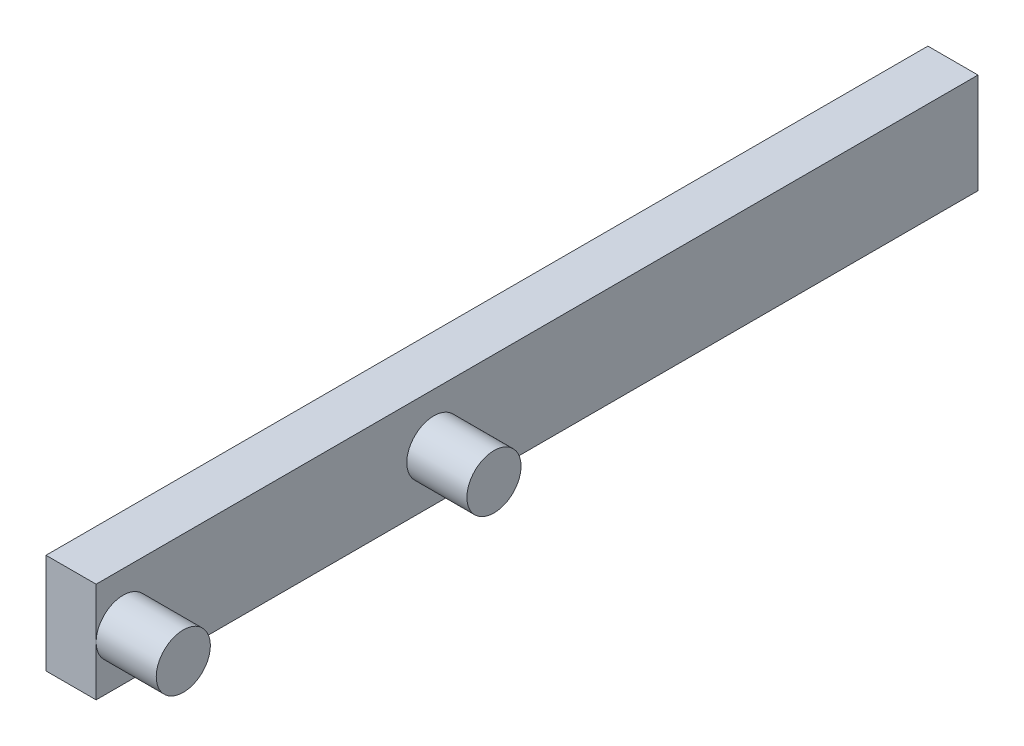
ISO-10303-21;
HEADER;
FILE_DESCRIPTION(('STEP AP214'),'2;1');
FILE_NAME('part.step','',(''),(''),'','','');
FILE_SCHEMA(('AUTOMOTIVE_DESIGN { 1 0 10303 214 1 1 1 1 }'));
ENDSEC;
DATA;
#1=APPLICATION_CONTEXT('core data for automotive mechanical design processes');
#2=APPLICATION_PROTOCOL_DEFINITION('international standard','automotive_design',2000,#1);
#3=PRODUCT_CONTEXT('',#1,'mechanical');
#4=PRODUCT('Part','Part','',(#3));
#5=PRODUCT_RELATED_PRODUCT_CATEGORY('part','',(#4));
#6=PRODUCT_DEFINITION_FORMATION('','',#4);
#7=PRODUCT_DEFINITION_CONTEXT('part definition',#1,'design');
#8=PRODUCT_DEFINITION('design','',#6,#7);
#9=PRODUCT_DEFINITION_SHAPE('','',#8);
#10=(LENGTH_UNIT() NAMED_UNIT(*) SI_UNIT(.MILLI.,.METRE.));
#11=(NAMED_UNIT(*) PLANE_ANGLE_UNIT() SI_UNIT($,.RADIAN.));
#12=(NAMED_UNIT(*) SI_UNIT($,.STERADIAN.) SOLID_ANGLE_UNIT());
#13=UNCERTAINTY_MEASURE_WITH_UNIT(LENGTH_MEASURE(1.E-05),#10,'distance_accuracy_value','');
#14=(GEOMETRIC_REPRESENTATION_CONTEXT(3) GLOBAL_UNCERTAINTY_ASSIGNED_CONTEXT((#13)) GLOBAL_UNIT_ASSIGNED_CONTEXT((#10,
#11,#12)) REPRESENTATION_CONTEXT('',''));
#15=CARTESIAN_POINT('',(0.,0.,0.));
#16=DIRECTION('',(0.,0.,1.));
#17=DIRECTION('',(1.,0.,0.));
#18=AXIS2_PLACEMENT_3D('',#15,#16,#17);
#19=CARTESIAN_POINT('',(2.5,-2.5,22.));
#20=DIRECTION('',(0.,0.,-1.));
#21=DIRECTION('',(-1.,0.,0.));
#22=AXIS2_PLACEMENT_3D('',#19,#20,#21);
#23=PLANE('',#22);
#24=DIRECTION('',(0.,-1.,0.));
#25=VECTOR('',#24,1.);
#26=CARTESIAN_POINT('',(0.,-2.5,22.));
#27=LINE('',#26,#25);
#28=CARTESIAN_POINT('',(0.,2.5,22.));
#29=VERTEX_POINT('',#28);
#30=CARTESIAN_POINT('',(0.,-2.5,22.));
#31=VERTEX_POINT('',#30);
#32=EDGE_CURVE('E102',#29,#31,#27,.T.);
#33=ORIENTED_EDGE('',*,*,#32,.T.);
#34=DIRECTION('',(-1.,0.,0.));
#35=VECTOR('',#34,1.);
#36=CARTESIAN_POINT('',(2.5,-2.5,22.));
#37=LINE('',#36,#35);
#38=CARTESIAN_POINT('',(2.5,-2.5,22.));
#39=VERTEX_POINT('',#38);
#40=EDGE_CURVE('E11',#39,#31,#37,.T.);
#41=ORIENTED_EDGE('',*,*,#40,.F.);
#42=DIRECTION('',(0.,-1.,0.));
#43=VECTOR('',#42,1.);
#44=CARTESIAN_POINT('',(2.5,-2.5,22.));
#45=LINE('',#44,#43);
#46=CARTESIAN_POINT('',(2.5,0.,22.));
#47=VERTEX_POINT('',#46);
#48=EDGE_CURVE('E80',#47,#39,#45,.T.);
#49=ORIENTED_EDGE('',*,*,#48,.F.);
#50=CARTESIAN_POINT('',(2.5,2.5,22.));
#51=VERTEX_POINT('',#50);
#52=EDGE_CURVE('E84',#51,#47,#45,.T.);
#53=ORIENTED_EDGE('',*,*,#52,.F.);
#54=DIRECTION('',(-1.,0.,0.));
#55=VECTOR('',#54,1.);
#56=CARTESIAN_POINT('',(2.5,2.5,22.));
#57=LINE('',#56,#55);
#58=EDGE_CURVE('E101',#51,#29,#57,.T.);
#59=ORIENTED_EDGE('',*,*,#58,.T.);
#60=EDGE_LOOP('',(#33,#41,#49,#53,#59));
#61=FACE_BOUND('',#60,.T.);
#62=ADVANCED_FACE('F33',(#61),#23,.F.);
#63=CARTESIAN_POINT('',(2.5,-2.5,-22.));
#64=DIRECTION('',(0.,1.,0.));
#65=DIRECTION('',(0.,0.,1.));
#66=AXIS2_PLACEMENT_3D('',#63,#64,#65);
#67=PLANE('',#66);
#68=DIRECTION('',(0.,0.,-1.));
#69=VECTOR('',#68,1.);
#70=CARTESIAN_POINT('',(0.,-2.5,-22.));
#71=LINE('',#70,#69);
#72=CARTESIAN_POINT('',(0.,-2.5,-22.));
#73=VERTEX_POINT('',#72);
#74=EDGE_CURVE('E104',#31,#73,#71,.T.);
#75=ORIENTED_EDGE('',*,*,#74,.T.);
#76=DIRECTION('',(-1.,0.,0.));
#77=VECTOR('',#76,1.);
#78=CARTESIAN_POINT('',(2.5,-2.5,-22.));
#79=LINE('',#78,#77);
#80=CARTESIAN_POINT('',(2.5,-2.5,-22.));
#81=VERTEX_POINT('',#80);
#82=EDGE_CURVE('E41',#81,#73,#79,.T.);
#83=ORIENTED_EDGE('',*,*,#82,.F.);
#84=DIRECTION('',(0.,0.,-1.));
#85=VECTOR('',#84,1.);
#86=CARTESIAN_POINT('',(2.5,-2.5,-22.));
#87=LINE('',#86,#85);
#88=EDGE_CURVE('E89',#39,#81,#87,.T.);
#89=ORIENTED_EDGE('',*,*,#88,.F.);
#90=ORIENTED_EDGE('',*,*,#40,.T.);
#91=EDGE_LOOP('',(#75,#83,#89,#90));
#92=FACE_BOUND('',#91,.T.);
#93=ADVANCED_FACE('F126',(#92),#67,.F.);
#94=CARTESIAN_POINT('',(2.5,-2.5,-22.));
#95=DIRECTION('',(0.,0.,1.));
#96=DIRECTION('',(1.,0.,0.));
#97=AXIS2_PLACEMENT_3D('',#94,#95,#96);
#98=PLANE('',#97);
#99=DIRECTION('',(0.,1.,0.));
#100=VECTOR('',#99,1.);
#101=CARTESIAN_POINT('',(0.,-2.5,-22.));
#102=LINE('',#101,#100);
#103=CARTESIAN_POINT('',(0.,2.5,-22.));
#104=VERTEX_POINT('',#103);
#105=EDGE_CURVE('E67',#73,#104,#102,.T.);
#106=ORIENTED_EDGE('',*,*,#105,.T.);
#107=DIRECTION('',(-1.,0.,0.));
#108=VECTOR('',#107,1.);
#109=CARTESIAN_POINT('',(2.5,2.5,-22.));
#110=LINE('',#109,#108);
#111=CARTESIAN_POINT('',(2.5,2.5,-22.));
#112=VERTEX_POINT('',#111);
#113=EDGE_CURVE('E109',#112,#104,#110,.T.);
#114=ORIENTED_EDGE('',*,*,#113,.F.);
#115=DIRECTION('',(0.,1.,0.));
#116=VECTOR('',#115,1.);
#117=CARTESIAN_POINT('',(2.5,-2.5,-22.));
#118=LINE('',#117,#116);
#119=EDGE_CURVE('E98',#81,#112,#118,.T.);
#120=ORIENTED_EDGE('',*,*,#119,.F.);
#121=ORIENTED_EDGE('',*,*,#82,.T.);
#122=EDGE_LOOP('',(#106,#114,#120,#121));
#123=FACE_BOUND('',#122,.T.);
#124=ADVANCED_FACE('F112',(#123),#98,.F.);
#125=CARTESIAN_POINT('',(2.5,2.5,-22.));
#126=DIRECTION('',(0.,-1.,0.));
#127=DIRECTION('',(0.,0.,-1.));
#128=AXIS2_PLACEMENT_3D('',#125,#126,#127);
#129=PLANE('',#128);
#130=DIRECTION('',(0.,0.,1.));
#131=VECTOR('',#130,1.);
#132=CARTESIAN_POINT('',(0.,2.5,-22.));
#133=LINE('',#132,#131);
#134=EDGE_CURVE('E73',#104,#29,#133,.T.);
#135=ORIENTED_EDGE('',*,*,#134,.T.);
#136=ORIENTED_EDGE('',*,*,#58,.F.);
#137=DIRECTION('',(0.,0.,1.));
#138=VECTOR('',#137,1.);
#139=CARTESIAN_POINT('',(2.5,2.5,-22.));
#140=LINE('',#139,#138);
#141=EDGE_CURVE('E49',#112,#51,#140,.T.);
#142=ORIENTED_EDGE('',*,*,#141,.F.);
#143=ORIENTED_EDGE('',*,*,#113,.T.);
#144=EDGE_LOOP('',(#135,#136,#142,#143));
#145=FACE_BOUND('',#144,.T.);
#146=ADVANCED_FACE('F117',(#145),#129,.F.);
#147=CARTESIAN_POINT('',(2.5,0.,0.));
#148=DIRECTION('',(1.,0.,0.));
#149=DIRECTION('',(0.,0.,-1.));
#150=AXIS2_PLACEMENT_3D('',#147,#148,#149);
#151=PLANE('',#150);
#152=CARTESIAN_POINT('',(2.5,0.,5.15));
#153=DIRECTION('',(1.,0.,0.));
#154=DIRECTION('',(0.,0.,-1.));
#155=AXIS2_PLACEMENT_3D('',#152,#153,#154);
#156=CIRCLE('',#155,1.35);
#157=CARTESIAN_POINT('',(2.5,0.,3.8));
#158=VERTEX_POINT('',#157);
#159=EDGE_CURVE('E207',#158,#158,#156,.T.);
#160=ORIENTED_EDGE('',*,*,#159,.F.);
#161=EDGE_LOOP('',(#160));
#162=FACE_BOUND('',#161,.T.);
#163=ORIENTED_EDGE('',*,*,#52,.T.);
#164=CARTESIAN_POINT('',(2.5,0.,20.65));
#165=DIRECTION('',(1.,0.,0.));
#166=DIRECTION('',(0.,0.,-1.));
#167=AXIS2_PLACEMENT_3D('',#164,#165,#166);
#168=CIRCLE('',#167,1.35);
#169=EDGE_CURVE('E87',#47,#47,#168,.T.);
#170=ORIENTED_EDGE('',*,*,#169,.F.);
#171=ORIENTED_EDGE('',*,*,#48,.T.);
#172=ORIENTED_EDGE('',*,*,#88,.T.);
#173=ORIENTED_EDGE('',*,*,#119,.T.);
#174=ORIENTED_EDGE('',*,*,#141,.T.);
#175=EDGE_LOOP('',(#163,#170,#171,#172,#173,#174));
#176=FACE_BOUND('',#175,.T.);
#177=ADVANCED_FACE('F85',(#162,#176),#151,.T.);
#178=CARTESIAN_POINT('',(0.,0.,0.));
#179=DIRECTION('',(1.,0.,0.));
#180=DIRECTION('',(0.,0.,-1.));
#181=AXIS2_PLACEMENT_3D('',#178,#179,#180);
#182=PLANE('',#181);
#183=ORIENTED_EDGE('',*,*,#32,.F.);
#184=ORIENTED_EDGE('',*,*,#134,.F.);
#185=ORIENTED_EDGE('',*,*,#105,.F.);
#186=ORIENTED_EDGE('',*,*,#74,.F.);
#187=EDGE_LOOP('',(#183,#184,#185,#186));
#188=FACE_BOUND('',#187,.T.);
#189=ADVANCED_FACE('F116',(#188),#182,.F.);
#190=CARTESIAN_POINT('',(5.5,0.,20.65));
#191=DIRECTION('',(-1.,0.,0.));
#192=DIRECTION('',(0.,0.,1.));
#193=AXIS2_PLACEMENT_3D('',#190,#191,#192);
#194=CYLINDRICAL_SURFACE('',#193,1.35);
#195=CARTESIAN_POINT('',(5.5,0.,20.65));
#196=DIRECTION('',(1.,0.,0.));
#197=DIRECTION('',(0.,0.,-1.));
#198=AXIS2_PLACEMENT_3D('',#195,#196,#197);
#199=CIRCLE('',#198,1.35);
#200=CARTESIAN_POINT('',(5.5,0.,19.3));
#201=VERTEX_POINT('',#200);
#202=EDGE_CURVE('E105',#201,#201,#199,.T.);
#203=ORIENTED_EDGE('',*,*,#202,.F.);
#204=EDGE_LOOP('',(#203));
#205=FACE_BOUND('',#204,.T.);
#206=ORIENTED_EDGE('',*,*,#169,.T.);
#207=EDGE_LOOP('',(#206));
#208=FACE_BOUND('',#207,.T.);
#209=ADVANCED_FACE('F152',(#205,#208),#194,.T.);
#210=CARTESIAN_POINT('',(5.5,0.,20.65));
#211=DIRECTION('',(1.,0.,0.));
#212=DIRECTION('',(0.,0.,-1.));
#213=AXIS2_PLACEMENT_3D('',#210,#211,#212);
#214=PLANE('',#213);
#215=ORIENTED_EDGE('',*,*,#202,.T.);
#216=EDGE_LOOP('',(#215));
#217=FACE_BOUND('',#216,.T.);
#218=ADVANCED_FACE('F170',(#217),#214,.T.);
#219=CARTESIAN_POINT('',(5.5,0.,5.15));
#220=DIRECTION('',(-1.,0.,0.));
#221=DIRECTION('',(0.,0.,1.));
#222=AXIS2_PLACEMENT_3D('',#219,#220,#221);
#223=CYLINDRICAL_SURFACE('',#222,1.35);
#224=CARTESIAN_POINT('',(5.5,0.,5.15));
#225=DIRECTION('',(1.,0.,0.));
#226=DIRECTION('',(0.,0.,-1.));
#227=AXIS2_PLACEMENT_3D('',#224,#225,#226);
#228=CIRCLE('',#227,1.35);
#229=CARTESIAN_POINT('',(5.5,0.,3.8));
#230=VERTEX_POINT('',#229);
#231=EDGE_CURVE('E206',#230,#230,#228,.T.);
#232=ORIENTED_EDGE('',*,*,#231,.F.);
#233=EDGE_LOOP('',(#232));
#234=FACE_BOUND('',#233,.T.);
#235=ORIENTED_EDGE('',*,*,#159,.T.);
#236=EDGE_LOOP('',(#235));
#237=FACE_BOUND('',#236,.T.);
#238=ADVANCED_FACE('F180',(#234,#237),#223,.T.);
#239=CARTESIAN_POINT('',(5.5,0.,5.15));
#240=DIRECTION('',(1.,0.,0.));
#241=DIRECTION('',(0.,0.,-1.));
#242=AXIS2_PLACEMENT_3D('',#239,#240,#241);
#243=PLANE('',#242);
#244=ORIENTED_EDGE('',*,*,#231,.T.);
#245=EDGE_LOOP('',(#244));
#246=FACE_BOUND('',#245,.T.);
#247=ADVANCED_FACE('F190',(#246),#243,.T.);
#248=CLOSED_SHELL('',(#62,#93,#124,#146,#177,#189,#209,#218,#238,#247));
#249=MANIFOLD_SOLID_BREP('B2',#248);
#250=ADVANCED_BREP_SHAPE_REPRESENTATION('',(#18,#249),#14);
#251=SHAPE_DEFINITION_REPRESENTATION(#9,#250);
ENDSEC;
END-ISO-10303-21;
